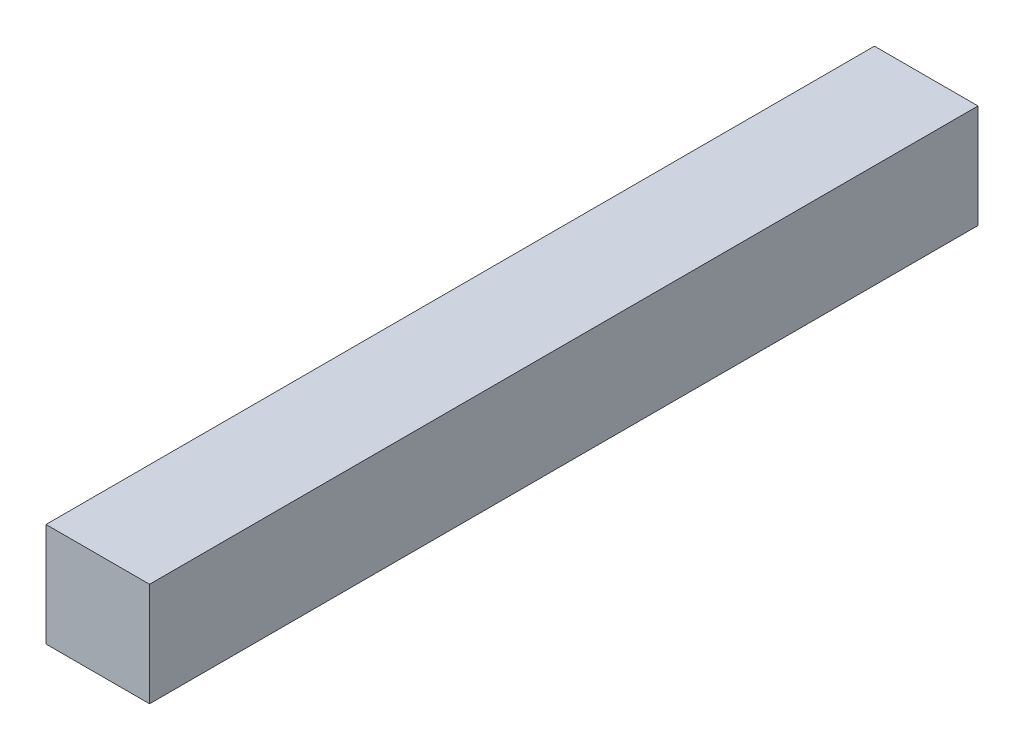
ISO-10303-21;
HEADER;
FILE_DESCRIPTION(('STEP AP214'),'2;1');
FILE_NAME('part.step','',(''),(''),'','','');
FILE_SCHEMA(('AUTOMOTIVE_DESIGN { 1 0 10303 214 1 1 1 1 }'));
ENDSEC;
DATA;
#1=APPLICATION_CONTEXT('core data for automotive mechanical design processes');
#2=APPLICATION_PROTOCOL_DEFINITION('international standard','automotive_design',2000,#1);
#3=PRODUCT_CONTEXT('',#1,'mechanical');
#4=PRODUCT('Part','Part','',(#3));
#5=PRODUCT_RELATED_PRODUCT_CATEGORY('part','',(#4));
#6=PRODUCT_DEFINITION_FORMATION('','',#4);
#7=PRODUCT_DEFINITION_CONTEXT('part definition',#1,'design');
#8=PRODUCT_DEFINITION('design','',#6,#7);
#9=PRODUCT_DEFINITION_SHAPE('','',#8);
#10=(LENGTH_UNIT() NAMED_UNIT(*) SI_UNIT(.MILLI.,.METRE.));
#11=(NAMED_UNIT(*) PLANE_ANGLE_UNIT() SI_UNIT($,.RADIAN.));
#12=(NAMED_UNIT(*) SI_UNIT($,.STERADIAN.) SOLID_ANGLE_UNIT());
#13=UNCERTAINTY_MEASURE_WITH_UNIT(LENGTH_MEASURE(1.E-05),#10,'distance_accuracy_value','');
#14=(GEOMETRIC_REPRESENTATION_CONTEXT(3) GLOBAL_UNCERTAINTY_ASSIGNED_CONTEXT((#13)) GLOBAL_UNIT_ASSIGNED_CONTEXT((#10,
#11,#12)) REPRESENTATION_CONTEXT('',''));
#15=CARTESIAN_POINT('',(0.,0.,0.));
#16=DIRECTION('',(0.,0.,1.));
#17=DIRECTION('',(1.,0.,0.));
#18=AXIS2_PLACEMENT_3D('',#15,#16,#17);
#19=CARTESIAN_POINT('',(0.,0.,203.2));
#20=DIRECTION('',(1.,0.,0.));
#21=DIRECTION('',(0.,0.,-1.));
#22=AXIS2_PLACEMENT_3D('',#19,#20,#21);
#23=PLANE('',#22);
#24=DIRECTION('',(0.,-1.,0.));
#25=VECTOR('',#24,1.);
#26=CARTESIAN_POINT('',(0.,0.,0.));
#27=LINE('',#26,#25);
#28=CARTESIAN_POINT('',(0.,25.4,0.));
#29=VERTEX_POINT('',#28);
#30=CARTESIAN_POINT('',(0.,0.,0.));
#31=VERTEX_POINT('',#30);
#32=EDGE_CURVE('E86',#29,#31,#27,.T.);
#33=ORIENTED_EDGE('',*,*,#32,.T.);
#34=DIRECTION('',(0.,0.,-1.));
#35=VECTOR('',#34,1.);
#36=CARTESIAN_POINT('',(0.,0.,203.2));
#37=LINE('',#36,#35);
#38=CARTESIAN_POINT('',(0.,0.,203.2));
#39=VERTEX_POINT('',#38);
#40=EDGE_CURVE('E11',#39,#31,#37,.T.);
#41=ORIENTED_EDGE('',*,*,#40,.F.);
#42=DIRECTION('',(0.,-1.,0.));
#43=VECTOR('',#42,1.);
#44=CARTESIAN_POINT('',(0.,0.,203.2));
#45=LINE('',#44,#43);
#46=CARTESIAN_POINT('',(0.,25.4,203.2));
#47=VERTEX_POINT('',#46);
#48=EDGE_CURVE('E104',#47,#39,#45,.T.);
#49=ORIENTED_EDGE('',*,*,#48,.F.);
#50=DIRECTION('',(0.,0.,-1.));
#51=VECTOR('',#50,1.);
#52=CARTESIAN_POINT('',(0.,25.4,203.2));
#53=LINE('',#52,#51);
#54=EDGE_CURVE('E98',#47,#29,#53,.T.);
#55=ORIENTED_EDGE('',*,*,#54,.T.);
#56=EDGE_LOOP('',(#33,#41,#49,#55));
#57=FACE_BOUND('',#56,.T.);
#58=ADVANCED_FACE('F42',(#57),#23,.F.);
#59=CARTESIAN_POINT('',(0.,0.,203.2));
#60=DIRECTION('',(0.,1.,0.));
#61=DIRECTION('',(0.,0.,1.));
#62=AXIS2_PLACEMENT_3D('',#59,#60,#61);
#63=PLANE('',#62);
#64=DIRECTION('',(1.,0.,0.));
#65=VECTOR('',#64,1.);
#66=CARTESIAN_POINT('',(0.,0.,0.));
#67=LINE('',#66,#65);
#68=CARTESIAN_POINT('',(25.4,0.,0.));
#69=VERTEX_POINT('',#68);
#70=EDGE_CURVE('E82',#31,#69,#67,.T.);
#71=ORIENTED_EDGE('',*,*,#70,.T.);
#72=DIRECTION('',(0.,0.,-1.));
#73=VECTOR('',#72,1.);
#74=CARTESIAN_POINT('',(25.4,0.,203.2));
#75=LINE('',#74,#73);
#76=CARTESIAN_POINT('',(25.4,0.,203.2));
#77=VERTEX_POINT('',#76);
#78=EDGE_CURVE('E49',#77,#69,#75,.T.);
#79=ORIENTED_EDGE('',*,*,#78,.F.);
#80=DIRECTION('',(1.,0.,0.));
#81=VECTOR('',#80,1.);
#82=CARTESIAN_POINT('',(0.,0.,203.2));
#83=LINE('',#82,#81);
#84=EDGE_CURVE('E94',#39,#77,#83,.T.);
#85=ORIENTED_EDGE('',*,*,#84,.F.);
#86=ORIENTED_EDGE('',*,*,#40,.T.);
#87=EDGE_LOOP('',(#71,#79,#85,#86));
#88=FACE_BOUND('',#87,.T.);
#89=ADVANCED_FACE('F93',(#88),#63,.F.);
#90=CARTESIAN_POINT('',(25.4,0.,203.2));
#91=DIRECTION('',(-1.,0.,0.));
#92=DIRECTION('',(0.,0.,1.));
#93=AXIS2_PLACEMENT_3D('',#90,#91,#92);
#94=PLANE('',#93);
#95=DIRECTION('',(0.,1.,0.));
#96=VECTOR('',#95,1.);
#97=CARTESIAN_POINT('',(25.4,0.,0.));
#98=LINE('',#97,#96);
#99=CARTESIAN_POINT('',(25.4,25.4,0.));
#100=VERTEX_POINT('',#99);
#101=EDGE_CURVE('E87',#69,#100,#98,.T.);
#102=ORIENTED_EDGE('',*,*,#101,.T.);
#103=DIRECTION('',(0.,0.,-1.));
#104=VECTOR('',#103,1.);
#105=CARTESIAN_POINT('',(25.4,25.4,203.2));
#106=LINE('',#105,#104);
#107=CARTESIAN_POINT('',(25.4,25.4,203.2));
#108=VERTEX_POINT('',#107);
#109=EDGE_CURVE('E110',#108,#100,#106,.T.);
#110=ORIENTED_EDGE('',*,*,#109,.F.);
#111=DIRECTION('',(0.,1.,0.));
#112=VECTOR('',#111,1.);
#113=CARTESIAN_POINT('',(25.4,0.,203.2));
#114=LINE('',#113,#112);
#115=EDGE_CURVE('E61',#77,#108,#114,.T.);
#116=ORIENTED_EDGE('',*,*,#115,.F.);
#117=ORIENTED_EDGE('',*,*,#78,.T.);
#118=EDGE_LOOP('',(#102,#110,#116,#117));
#119=FACE_BOUND('',#118,.T.);
#120=ADVANCED_FACE('F113',(#119),#94,.F.);
#121=CARTESIAN_POINT('',(0.,25.4,203.2));
#122=DIRECTION('',(0.,-1.,0.));
#123=DIRECTION('',(0.,0.,-1.));
#124=AXIS2_PLACEMENT_3D('',#121,#122,#123);
#125=PLANE('',#124);
#126=DIRECTION('',(-1.,0.,0.));
#127=VECTOR('',#126,1.);
#128=CARTESIAN_POINT('',(0.,25.4,0.));
#129=LINE('',#128,#127);
#130=EDGE_CURVE('E102',#100,#29,#129,.T.);
#131=ORIENTED_EDGE('',*,*,#130,.T.);
#132=ORIENTED_EDGE('',*,*,#54,.F.);
#133=DIRECTION('',(-1.,0.,0.));
#134=VECTOR('',#133,1.);
#135=CARTESIAN_POINT('',(0.,25.4,203.2));
#136=LINE('',#135,#134);
#137=EDGE_CURVE('E56',#108,#47,#136,.T.);
#138=ORIENTED_EDGE('',*,*,#137,.F.);
#139=ORIENTED_EDGE('',*,*,#109,.T.);
#140=EDGE_LOOP('',(#131,#132,#138,#139));
#141=FACE_BOUND('',#140,.T.);
#142=ADVANCED_FACE('F115',(#141),#125,.F.);
#143=CARTESIAN_POINT('',(0.,25.4,203.2));
#144=DIRECTION('',(0.,0.,-1.));
#145=DIRECTION('',(-1.,0.,0.));
#146=AXIS2_PLACEMENT_3D('',#143,#144,#145);
#147=PLANE('',#146);
#148=ORIENTED_EDGE('',*,*,#48,.T.);
#149=ORIENTED_EDGE('',*,*,#84,.T.);
#150=ORIENTED_EDGE('',*,*,#115,.T.);
#151=ORIENTED_EDGE('',*,*,#137,.T.);
#152=EDGE_LOOP('',(#148,#149,#150,#151));
#153=FACE_BOUND('',#152,.T.);
#154=ADVANCED_FACE('F116',(#153),#147,.F.);
#155=CARTESIAN_POINT('',(0.,25.4,0.));
#156=DIRECTION('',(0.,0.,-1.));
#157=DIRECTION('',(-1.,0.,0.));
#158=AXIS2_PLACEMENT_3D('',#155,#156,#157);
#159=PLANE('',#158);
#160=ORIENTED_EDGE('',*,*,#32,.F.);
#161=ORIENTED_EDGE('',*,*,#130,.F.);
#162=ORIENTED_EDGE('',*,*,#101,.F.);
#163=ORIENTED_EDGE('',*,*,#70,.F.);
#164=EDGE_LOOP('',(#160,#161,#162,#163));
#165=FACE_BOUND('',#164,.T.);
#166=ADVANCED_FACE('F83',(#165),#159,.T.);
#167=CLOSED_SHELL('',(#58,#89,#120,#142,#154,#166));
#168=MANIFOLD_SOLID_BREP('B2',#167);
#169=ADVANCED_BREP_SHAPE_REPRESENTATION('',(#18,#168),#14);
#170=SHAPE_DEFINITION_REPRESENTATION(#9,#169);
ENDSEC;
END-ISO-10303-21;
